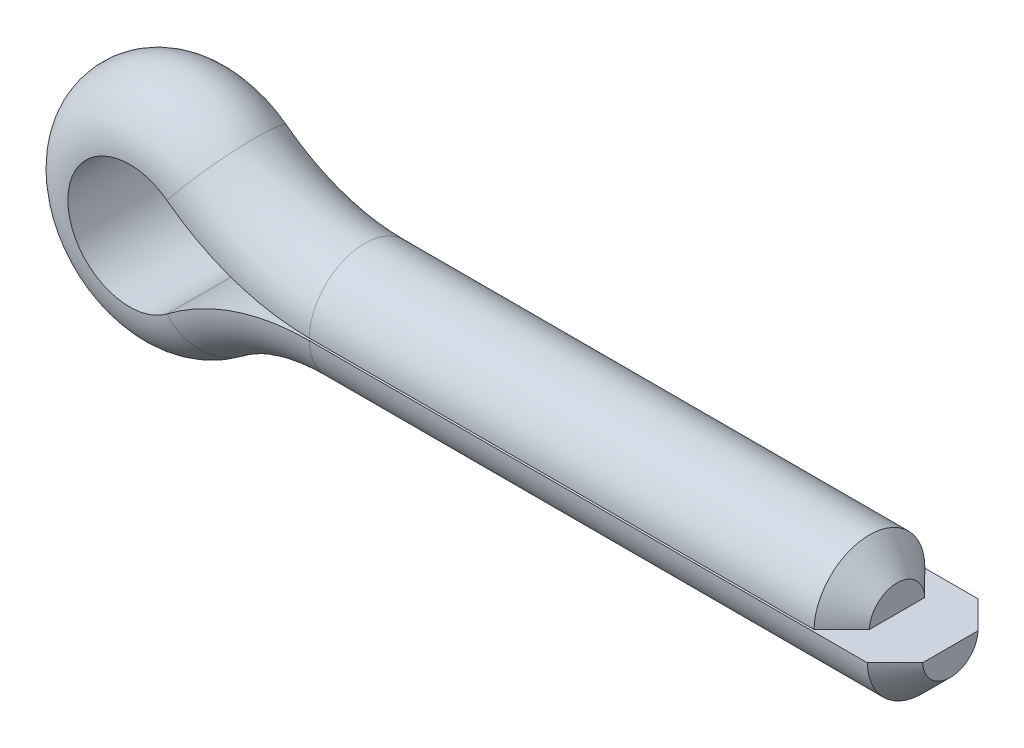
ISO-10303-21;
HEADER;
FILE_DESCRIPTION(('STEP AP214'),'2;1');
FILE_NAME('part.step','',(''),(''),'','','');
FILE_SCHEMA(('AUTOMOTIVE_DESIGN { 1 0 10303 214 1 1 1 1 }'));
ENDSEC;
DATA;
#1=APPLICATION_CONTEXT('core data for automotive mechanical design processes');
#2=APPLICATION_PROTOCOL_DEFINITION('international standard','automotive_design',2000,#1);
#3=PRODUCT_CONTEXT('',#1,'mechanical');
#4=PRODUCT('Part','Part','',(#3));
#5=PRODUCT_RELATED_PRODUCT_CATEGORY('part','',(#4));
#6=PRODUCT_DEFINITION_FORMATION('','',#4);
#7=PRODUCT_DEFINITION_CONTEXT('part definition',#1,'design');
#8=PRODUCT_DEFINITION('design','',#6,#7);
#9=PRODUCT_DEFINITION_SHAPE('','',#8);
#10=(LENGTH_UNIT() NAMED_UNIT(*) SI_UNIT(.MILLI.,.METRE.));
#11=(NAMED_UNIT(*) PLANE_ANGLE_UNIT() SI_UNIT($,.RADIAN.));
#12=(NAMED_UNIT(*) SI_UNIT($,.STERADIAN.) SOLID_ANGLE_UNIT());
#13=UNCERTAINTY_MEASURE_WITH_UNIT(LENGTH_MEASURE(1.E-05),#10,'distance_accuracy_value','');
#14=(GEOMETRIC_REPRESENTATION_CONTEXT(3) GLOBAL_UNCERTAINTY_ASSIGNED_CONTEXT((#13)) GLOBAL_UNIT_ASSIGNED_CONTEXT((#10,
#11,#12)) REPRESENTATION_CONTEXT('',''));
#15=CARTESIAN_POINT('',(0.,0.,0.));
#16=DIRECTION('',(0.,0.,1.));
#17=DIRECTION('',(1.,0.,0.));
#18=AXIS2_PLACEMENT_3D('',#15,#16,#17);
#19=CARTESIAN_POINT('',(1.27,0.,0.));
#20=DIRECTION('',(-1.,0.,0.));
#21=DIRECTION('',(0.,0.,-1.));
#22=AXIS2_PLACEMENT_3D('',#19,#20,#21);
#23=PLANE('',#22);
#24=DIRECTION('',(0.,0.,-1.));
#25=VECTOR('',#24,1.);
#26=CARTESIAN_POINT('',(1.27,-0.0254,1.32055574664609));
#27=LINE('',#26,#25);
#28=CARTESIAN_POINT('',(1.27,-0.0254,0.659911357683741));
#29=VERTEX_POINT('',#28);
#30=CARTESIAN_POINT('',(1.27,-0.0254000000000001,-0.65991135768374));
#31=VERTEX_POINT('',#30);
#32=EDGE_CURVE('E136',#29,#31,#27,.T.);
#33=ORIENTED_EDGE('',*,*,#32,.F.);
#34=CARTESIAN_POINT('',(1.27,0.,0.));
#35=DIRECTION('',(-1.,0.,0.));
#36=DIRECTION('',(0.,-1.,0.));
#37=AXIS2_PLACEMENT_3D('',#34,#35,#36);
#38=CIRCLE('',#37,0.660399999999999);
#39=EDGE_CURVE('E243',#29,#31,#38,.F.);
#40=ORIENTED_EDGE('',*,*,#39,.T.);
#41=EDGE_LOOP('',(#33,#40));
#42=FACE_BOUND('',#41,.T.);
#43=ADVANCED_FACE('F58',(#42),#23,.F.);
#44=CARTESIAN_POINT('',(0.,0.,0.));
#45=DIRECTION('',(1.,0.,0.));
#46=DIRECTION('',(0.,0.,-1.));
#47=AXIS2_PLACEMENT_3D('',#44,#45,#46);
#48=PLANE('',#47);
#49=DIRECTION('',(0.,0.,-1.));
#50=VECTOR('',#49,1.);
#51=CARTESIAN_POINT('',(0.,0.0254,1.32055574664609));
#52=LINE('',#51,#50);
#53=CARTESIAN_POINT('',(0.,0.0254,0.659911357683748));
#54=VERTEX_POINT('',#53);
#55=CARTESIAN_POINT('',(0.,0.0254000000000001,-0.659911357683747));
#56=VERTEX_POINT('',#55);
#57=EDGE_CURVE('E183',#54,#56,#52,.T.);
#58=ORIENTED_EDGE('',*,*,#57,.T.);
#59=CARTESIAN_POINT('',(0.,0.,0.));
#60=DIRECTION('',(1.,0.,0.));
#61=DIRECTION('',(0.,0.,-1.));
#62=AXIS2_PLACEMENT_3D('',#59,#60,#61);
#63=CIRCLE('',#62,0.660400000000005);
#64=EDGE_CURVE('E240',#56,#54,#63,.T.);
#65=ORIENTED_EDGE('',*,*,#64,.T.);
#66=EDGE_LOOP('',(#58,#65));
#67=FACE_BOUND('',#66,.T.);
#68=ADVANCED_FACE('F219',(#67),#48,.T.);
#69=CARTESIAN_POINT('',(1.27,0.,0.));
#70=DIRECTION('',(-1.,0.,0.));
#71=DIRECTION('',(0.,-1.,0.));
#72=AXIS2_PLACEMENT_3D('',#69,#70,#71);
#73=CYLINDRICAL_SURFACE('',#72,1.3208);
#74=DIRECTION('',(-1.,0.,0.));
#75=VECTOR('',#74,1.);
#76=CARTESIAN_POINT('',(1.27,-0.0254000000000001,-1.32055574664609));
#77=LINE('',#76,#75);
#78=CARTESIAN_POINT('',(0.609599999999996,-0.0254,-1.32055574664609));
#79=VERTEX_POINT('',#78);
#80=CARTESIAN_POINT('',(-12.7,-0.0253999999999985,-1.32055574664609));
#81=VERTEX_POINT('',#80);
#82=EDGE_CURVE('E121',#79,#81,#77,.T.);
#83=ORIENTED_EDGE('',*,*,#82,.F.);
#84=CARTESIAN_POINT('',(0.609599999999996,0.,0.));
#85=DIRECTION('',(-1.,0.,0.));
#86=DIRECTION('',(0.,-1.,0.));
#87=AXIS2_PLACEMENT_3D('',#84,#85,#86);
#88=CIRCLE('',#87,1.3208);
#89=CARTESIAN_POINT('',(0.609599999999996,-0.0253999999999999,1.32055574664609));
#90=VERTEX_POINT('',#89);
#91=EDGE_CURVE('E195',#79,#90,#88,.T.);
#92=ORIENTED_EDGE('',*,*,#91,.T.);
#93=DIRECTION('',(-1.,0.,0.));
#94=VECTOR('',#93,1.);
#95=CARTESIAN_POINT('',(1.27,-0.0254,1.32055574664609));
#96=LINE('',#95,#94);
#97=CARTESIAN_POINT('',(-12.7,-0.0253999999999983,1.32055574664609));
#98=VERTEX_POINT('',#97);
#99=EDGE_CURVE('E152',#90,#98,#96,.T.);
#100=ORIENTED_EDGE('',*,*,#99,.T.);
#101=CARTESIAN_POINT('',(-12.7,0.,0.));
#102=DIRECTION('',(-1.,0.,0.));
#103=DIRECTION('',(0.,0.,-1.));
#104=AXIS2_PLACEMENT_3D('',#101,#102,#103);
#105=CIRCLE('',#104,1.3208);
#106=EDGE_CURVE('E135',#81,#98,#105,.T.);
#107=ORIENTED_EDGE('',*,*,#106,.F.);
#108=EDGE_LOOP('',(#83,#92,#100,#107));
#109=FACE_BOUND('',#108,.T.);
#110=ADVANCED_FACE('F154',(#109),#73,.T.);
#111=CARTESIAN_POINT('',(1.27,-0.0254,1.32055574664609));
#112=DIRECTION('',(0.,1.,0.));
#113=DIRECTION('',(-1.,0.,0.));
#114=AXIS2_PLACEMENT_3D('',#111,#112,#113);
#115=PLANE('',#114);
#116=ORIENTED_EDGE('',*,*,#99,.F.);
#117=CARTESIAN_POINT('',(0.609599999999996,-0.0253999999999999,1.32055574664609));
#118=CARTESIAN_POINT('',(0.719680251228278,-0.0253999999999999,1.21046192830129));
#119=CARTESIAN_POINT('',(0.829753710105949,-0.0254,1.10036132011854));
#120=CARTESIAN_POINT('',(1.04988704343932,-0.0254,0.880146523797791));
#121=CARTESIAN_POINT('',(1.15994691789498,-0.0254,0.770032335659758));
#122=CARTESIAN_POINT('',(1.27,-0.0254,0.659911357683741));
#123=B_SPLINE_CURVE_WITH_KNOTS('',3,(#117,#118,#119,#120,#121,#122),.UNSPECIFIED.,.F.,.F.,(4,2,
4),(0.,0.467059731130343,0.934119463445654),.UNSPECIFIED.);
#124=EDGE_CURVE('E202',#90,#29,#123,.T.);
#125=ORIENTED_EDGE('',*,*,#124,.T.);
#126=ORIENTED_EDGE('',*,*,#32,.T.);
#127=CARTESIAN_POINT('',(1.27,-0.0254000000000001,-0.659911357683741));
#128=CARTESIAN_POINT('',(1.08768777436221,-0.0254000000000001,-0.842327973854175));
#129=CARTESIAN_POINT('',(0.905360257765116,-0.0254000000000001,-1.02472930370601));
#130=CARTESIAN_POINT('',(0.685212290766379,-0.0254000000000001,-1.24492947080261));
#131=CARTESIAN_POINT('',(0.647406474030141,-0.0254000000000001,-1.28274293727156));
#132=CARTESIAN_POINT('',(0.609599999999996,-0.0254,-1.32055574664609));
#133=B_SPLINE_CURVE_WITH_KNOTS('',3,(#127,#128,#129,#130,#131,#132),.UNSPECIFIED.,.F.,.F.,(4,2,
4),(0.,0.773706737699516,0.934119462348877),.UNSPECIFIED.);
#134=EDGE_CURVE('E130',#31,#79,#133,.T.);
#135=ORIENTED_EDGE('',*,*,#134,.T.);
#136=ORIENTED_EDGE('',*,*,#82,.T.);
#137=DIRECTION('',(0.,0.,-1.));
#138=VECTOR('',#137,1.);
#139=CARTESIAN_POINT('',(-12.7,-0.0253999999999983,1.32055574664609));
#140=LINE('',#139,#138);
#141=EDGE_CURVE('E126',#98,#81,#140,.T.);
#142=ORIENTED_EDGE('',*,*,#141,.F.);
#143=EDGE_LOOP('',(#116,#125,#126,#135,#136,#142));
#144=FACE_BOUND('',#143,.T.);
#145=ADVANCED_FACE('F124',(#144),#115,.T.);
#146=CARTESIAN_POINT('',(-12.7,-5.6134,0.));
#147=DIRECTION('',(0.,0.,1.));
#148=DIRECTION('',(1.,0.,0.));
#149=AXIS2_PLACEMENT_3D('',#146,#147,#148);
#150=TOROIDAL_SURFACE('',#149,5.6134,1.3208);
#151=CARTESIAN_POINT('',(-12.7,-5.6134,1.32055574664609));
#152=DIRECTION('',(0.,0.,1.));
#153=DIRECTION('',(0.,1.,0.));
#154=AXIS2_PLACEMENT_3D('',#151,#152,#153);
#155=CIRCLE('',#154,5.588);
#156=CARTESIAN_POINT('',(-16.0899969086765,-1.17114100719425,1.32055574664609));
#157=VERTEX_POINT('',#156);
#158=EDGE_CURVE('E151',#98,#157,#155,.T.);
#159=ORIENTED_EDGE('',*,*,#158,.T.);
#160=CARTESIAN_POINT('',(-16.1054059855342,-1.15094892086331,0.));
#161=DIRECTION('',(-0.794964028776978,-0.606656569197661,0.));
#162=DIRECTION('',(0.,0.,-1.));
#163=AXIS2_PLACEMENT_3D('',#160,#161,#162);
#164=CIRCLE('',#163,1.3208);
#165=CARTESIAN_POINT('',(-16.0899969086765,-1.17114100719425,-1.32055574664609));
#166=VERTEX_POINT('',#165);
#167=EDGE_CURVE('E145',#166,#157,#164,.T.);
#168=ORIENTED_EDGE('',*,*,#167,.F.);
#169=CARTESIAN_POINT('',(-12.7,-5.6134,-1.32055574664609));
#170=DIRECTION('',(0.,0.,1.));
#171=DIRECTION('',(0.,1.,0.));
#172=AXIS2_PLACEMENT_3D('',#169,#170,#171);
#173=CIRCLE('',#172,5.588);
#174=EDGE_CURVE('E141',#81,#166,#173,.T.);
#175=ORIENTED_EDGE('',*,*,#174,.F.);
#176=ORIENTED_EDGE('',*,*,#106,.T.);
#177=EDGE_LOOP('',(#159,#168,#175,#176));
#178=FACE_BOUND('',#177,.T.);
#179=ADVANCED_FACE('F143',(#178),#150,.T.);
#180=CARTESIAN_POINT('',(-12.7,-5.6134,0.));
#181=DIRECTION('',(0.,0.,1.));
#182=DIRECTION('',(1.,0.,0.));
#183=AXIS2_PLACEMENT_3D('',#180,#181,#182);
#184=CYLINDRICAL_SURFACE('',#183,5.588);
#185=DIRECTION('',(0.,0.,-1.));
#186=VECTOR('',#185,1.);
#187=CARTESIAN_POINT('',(-16.0899969086765,-1.17114100719425,1.32055574664609));
#188=LINE('',#187,#186);
#189=EDGE_CURVE('E159',#157,#166,#188,.T.);
#190=ORIENTED_EDGE('',*,*,#189,.F.);
#191=ORIENTED_EDGE('',*,*,#158,.F.);
#192=ORIENTED_EDGE('',*,*,#141,.T.);
#193=ORIENTED_EDGE('',*,*,#174,.T.);
#194=EDGE_LOOP('',(#190,#191,#192,#193));
#195=FACE_BOUND('',#194,.T.);
#196=ADVANCED_FACE('F150',(#195),#184,.T.);
#197=CARTESIAN_POINT('',(-16.9837233664185,0.,0.));
#198=DIRECTION('',(0.,0.,-1.));
#199=DIRECTION('',(-1.,0.,0.));
#200=AXIS2_PLACEMENT_3D('',#197,#198,#199);
#201=TOROIDAL_SURFACE('',#200,1.4478,1.3208);
#202=CARTESIAN_POINT('',(-16.9837233664185,0.,1.32055574664609));
#203=DIRECTION('',(0.,0.,-1.));
#204=DIRECTION('',(0.60665656919766,-0.794964028776978,0.));
#205=AXIS2_PLACEMENT_3D('',#202,#203,#204);
#206=CIRCLE('',#205,1.4732);
#207=CARTESIAN_POINT('',(-16.0899969086765,1.17114100719425,1.32055574664609));
#208=VERTEX_POINT('',#207);
#209=EDGE_CURVE('E164',#157,#208,#206,.T.);
#210=ORIENTED_EDGE('',*,*,#209,.T.);
#211=CARTESIAN_POINT('',(-16.1054059855342,1.15094892086331,0.));
#212=DIRECTION('',(0.794964028776978,-0.60665656919766,0.));
#213=DIRECTION('',(0.,0.,-1.));
#214=AXIS2_PLACEMENT_3D('',#211,#212,#213);
#215=CIRCLE('',#214,1.3208);
#216=CARTESIAN_POINT('',(-16.0899969086765,1.17114100719425,-1.32055574664609));
#217=VERTEX_POINT('',#216);
#218=EDGE_CURVE('E161',#217,#208,#215,.T.);
#219=ORIENTED_EDGE('',*,*,#218,.F.);
#220=CARTESIAN_POINT('',(-16.9837233664185,0.,-1.32055574664609));
#221=DIRECTION('',(0.,0.,-1.));
#222=DIRECTION('',(0.60665656919766,-0.794964028776978,0.));
#223=AXIS2_PLACEMENT_3D('',#220,#221,#222);
#224=CIRCLE('',#223,1.4732);
#225=EDGE_CURVE('E165',#166,#217,#224,.T.);
#226=ORIENTED_EDGE('',*,*,#225,.F.);
#227=ORIENTED_EDGE('',*,*,#167,.T.);
#228=EDGE_LOOP('',(#210,#219,#226,#227));
#229=FACE_BOUND('',#228,.T.);
#230=ADVANCED_FACE('F287',(#229),#201,.T.);
#231=CARTESIAN_POINT('',(-16.9837233664185,0.,0.));
#232=DIRECTION('',(0.,0.,-1.));
#233=DIRECTION('',(-1.,0.,0.));
#234=AXIS2_PLACEMENT_3D('',#231,#232,#233);
#235=CYLINDRICAL_SURFACE('',#234,1.4732);
#236=DIRECTION('',(0.,0.,-1.));
#237=VECTOR('',#236,1.);
#238=CARTESIAN_POINT('',(-16.0899969086765,1.17114100719425,1.32055574664609));
#239=LINE('',#238,#237);
#240=EDGE_CURVE('E168',#208,#217,#239,.T.);
#241=ORIENTED_EDGE('',*,*,#240,.F.);
#242=ORIENTED_EDGE('',*,*,#209,.F.);
#243=ORIENTED_EDGE('',*,*,#189,.T.);
#244=ORIENTED_EDGE('',*,*,#225,.T.);
#245=EDGE_LOOP('',(#241,#242,#243,#244));
#246=FACE_BOUND('',#245,.T.);
#247=ADVANCED_FACE('F279',(#246),#235,.F.);
#248=CARTESIAN_POINT('',(-12.7,5.6134,0.));
#249=DIRECTION('',(0.,0.,1.));
#250=DIRECTION('',(1.,0.,0.));
#251=AXIS2_PLACEMENT_3D('',#248,#249,#250);
#252=TOROIDAL_SURFACE('',#251,5.6134,1.3208);
#253=CARTESIAN_POINT('',(-12.7,5.6134,1.32055574664609));
#254=DIRECTION('',(0.,0.,1.));
#255=DIRECTION('',(-0.606656569197661,-0.794964028776978,0.));
#256=AXIS2_PLACEMENT_3D('',#253,#254,#255);
#257=CIRCLE('',#256,5.588);
#258=CARTESIAN_POINT('',(-12.7,0.0253999999999992,1.32055574664609));
#259=VERTEX_POINT('',#258);
#260=EDGE_CURVE('E174',#208,#259,#257,.T.);
#261=ORIENTED_EDGE('',*,*,#260,.T.);
#262=CARTESIAN_POINT('',(-12.7,0.,0.));
#263=DIRECTION('',(1.,0.,0.));
#264=DIRECTION('',(0.,0.,-1.));
#265=AXIS2_PLACEMENT_3D('',#262,#263,#264);
#266=CIRCLE('',#265,1.3208);
#267=CARTESIAN_POINT('',(-12.7,0.0253999999999992,-1.32055574664609));
#268=VERTEX_POINT('',#267);
#269=EDGE_CURVE('E171',#268,#259,#266,.T.);
#270=ORIENTED_EDGE('',*,*,#269,.F.);
#271=CARTESIAN_POINT('',(-12.7,5.6134,-1.32055574664609));
#272=DIRECTION('',(0.,0.,1.));
#273=DIRECTION('',(-0.606656569197661,-0.794964028776978,0.));
#274=AXIS2_PLACEMENT_3D('',#271,#272,#273);
#275=CIRCLE('',#274,5.588);
#276=EDGE_CURVE('E175',#217,#268,#275,.T.);
#277=ORIENTED_EDGE('',*,*,#276,.F.);
#278=ORIENTED_EDGE('',*,*,#218,.T.);
#279=EDGE_LOOP('',(#261,#270,#277,#278));
#280=FACE_BOUND('',#279,.T.);
#281=ADVANCED_FACE('F271',(#280),#252,.T.);
#282=CARTESIAN_POINT('',(-12.7,5.6134,0.));
#283=DIRECTION('',(0.,0.,1.));
#284=DIRECTION('',(1.,0.,0.));
#285=AXIS2_PLACEMENT_3D('',#282,#283,#284);
#286=CYLINDRICAL_SURFACE('',#285,5.588);
#287=DIRECTION('',(0.,0.,-1.));
#288=VECTOR('',#287,1.);
#289=CARTESIAN_POINT('',(-12.7,0.0253999999999983,1.32055574664609));
#290=LINE('',#289,#288);
#291=EDGE_CURVE('E178',#259,#268,#290,.T.);
#292=ORIENTED_EDGE('',*,*,#291,.F.);
#293=ORIENTED_EDGE('',*,*,#260,.F.);
#294=ORIENTED_EDGE('',*,*,#240,.T.);
#295=ORIENTED_EDGE('',*,*,#276,.T.);
#296=EDGE_LOOP('',(#292,#293,#294,#295));
#297=FACE_BOUND('',#296,.T.);
#298=ADVANCED_FACE('F228',(#297),#286,.T.);
#299=CARTESIAN_POINT('',(-12.7,0.,0.));
#300=DIRECTION('',(1.,0.,0.));
#301=DIRECTION('',(0.,1.,0.));
#302=AXIS2_PLACEMENT_3D('',#299,#300,#301);
#303=CYLINDRICAL_SURFACE('',#302,1.3208);
#304=DIRECTION('',(1.,0.,0.));
#305=VECTOR('',#304,1.);
#306=CARTESIAN_POINT('',(-12.7,0.0253999999999992,1.32055574664609));
#307=LINE('',#306,#305);
#308=CARTESIAN_POINT('',(-0.660399999999997,0.0254,1.32055574664609));
#309=VERTEX_POINT('',#308);
#310=EDGE_CURVE('E181',#259,#309,#307,.T.);
#311=ORIENTED_EDGE('',*,*,#310,.T.);
#312=CARTESIAN_POINT('',(-0.660399999999997,0.,0.));
#313=DIRECTION('',(1.,0.,0.));
#314=DIRECTION('',(0.,1.,0.));
#315=AXIS2_PLACEMENT_3D('',#312,#313,#314);
#316=CIRCLE('',#315,1.3208);
#317=CARTESIAN_POINT('',(-0.660399999999997,0.0254000000000001,-1.32055574664609));
#318=VERTEX_POINT('',#317);
#319=EDGE_CURVE('E12',#309,#318,#316,.F.);
#320=ORIENTED_EDGE('',*,*,#319,.T.);
#321=DIRECTION('',(1.,0.,0.));
#322=VECTOR('',#321,1.);
#323=CARTESIAN_POINT('',(-12.7,0.0253999999999993,-1.32055574664609));
#324=LINE('',#323,#322);
#325=EDGE_CURVE('E184',#268,#318,#324,.T.);
#326=ORIENTED_EDGE('',*,*,#325,.F.);
#327=ORIENTED_EDGE('',*,*,#269,.T.);
#328=EDGE_LOOP('',(#311,#320,#326,#327));
#329=FACE_BOUND('',#328,.T.);
#330=ADVANCED_FACE('F227',(#329),#303,.T.);
#331=CARTESIAN_POINT('',(-12.7,0.0253999999999992,1.32055574664609));
#332=DIRECTION('',(0.,-1.,0.));
#333=DIRECTION('',(1.,0.,0.));
#334=AXIS2_PLACEMENT_3D('',#331,#332,#333);
#335=PLANE('',#334);
#336=ORIENTED_EDGE('',*,*,#57,.F.);
#337=CARTESIAN_POINT('',(0.,0.0254,0.659911357683748));
#338=CARTESIAN_POINT('',(-0.182312225637788,0.0254,0.842327973854184));
#339=CARTESIAN_POINT('',(-0.364639742234886,0.0254,1.02472930370602));
#340=CARTESIAN_POINT('',(-0.584787709233622,0.0254,1.24492947080262));
#341=CARTESIAN_POINT('',(-0.622593525969856,0.0254,1.28274293727156));
#342=CARTESIAN_POINT('',(-0.660399999999997,0.0254,1.32055574664609));
#343=B_SPLINE_CURVE_WITH_KNOTS('',3,(#337,#338,#339,#340,#341,#342),.UNSPECIFIED.,.F.,.F.,(4,2,
4),(0.,0.773706737699525,0.93411946234887),.UNSPECIFIED.);
#344=EDGE_CURVE('E67',#54,#309,#343,.T.);
#345=ORIENTED_EDGE('',*,*,#344,.T.);
#346=ORIENTED_EDGE('',*,*,#310,.F.);
#347=ORIENTED_EDGE('',*,*,#291,.T.);
#348=ORIENTED_EDGE('',*,*,#325,.T.);
#349=CARTESIAN_POINT('',(-0.660399999999997,0.0254000000000001,-1.32055574664609));
#350=CARTESIAN_POINT('',(-0.550319748771716,0.0254000000000001,-1.21046192830129));
#351=CARTESIAN_POINT('',(-0.440246289894046,0.0254000000000001,-1.10036132011854));
#352=CARTESIAN_POINT('',(-0.220112956560679,0.0254000000000001,-0.880146523797795));
#353=CARTESIAN_POINT('',(-0.110053082105017,0.0254000000000001,-0.770032335659764));
#354=CARTESIAN_POINT('',(0.,0.0254000000000001,-0.659911357683748));
#355=B_SPLINE_CURVE_WITH_KNOTS('',3,(#349,#350,#351,#352,#353,#354),.UNSPECIFIED.,.F.,.F.,(4,2,
4),(0.,0.467059731130339,0.934119463445646),.UNSPECIFIED.);
#356=EDGE_CURVE('E232',#318,#56,#355,.T.);
#357=ORIENTED_EDGE('',*,*,#356,.T.);
#358=EDGE_LOOP('',(#336,#345,#346,#347,#348,#357));
#359=FACE_BOUND('',#358,.T.);
#360=ADVANCED_FACE('F214',(#359),#335,.T.);
#361=CARTESIAN_POINT('',(0.609599999999996,0.,0.));
#362=DIRECTION('',(-1.,0.,0.));
#363=DIRECTION('',(0.,-1.,0.));
#364=AXIS2_PLACEMENT_3D('',#361,#362,#363);
#365=CONICAL_SURFACE('',#364,1.3208,0.785398163397449);
#366=ORIENTED_EDGE('',*,*,#134,.F.);
#367=ORIENTED_EDGE('',*,*,#39,.F.);
#368=ORIENTED_EDGE('',*,*,#124,.F.);
#369=ORIENTED_EDGE('',*,*,#91,.F.);
#370=EDGE_LOOP('',(#366,#367,#368,#369));
#371=FACE_BOUND('',#370,.T.);
#372=ADVANCED_FACE('F210',(#371),#365,.T.);
#373=CARTESIAN_POINT('',(0.,0.,0.));
#374=DIRECTION('',(-1.,0.,0.));
#375=DIRECTION('',(0.,-1.,0.));
#376=AXIS2_PLACEMENT_3D('',#373,#374,#375);
#377=CONICAL_SURFACE('',#376,0.660400000000005,0.785398163397447);
#378=ORIENTED_EDGE('',*,*,#356,.F.);
#379=ORIENTED_EDGE('',*,*,#319,.F.);
#380=ORIENTED_EDGE('',*,*,#344,.F.);
#381=ORIENTED_EDGE('',*,*,#64,.F.);
#382=EDGE_LOOP('',(#378,#379,#380,#381));
#383=FACE_BOUND('',#382,.T.);
#384=ADVANCED_FACE('F60',(#383),#377,.T.);
#385=CLOSED_SHELL('',(#43,#68,#110,#145,#179,#196,#230,#247,#281,#298,#330,#360,#372,#384));
#386=MANIFOLD_SOLID_BREP('B2',#385);
#387=ADVANCED_BREP_SHAPE_REPRESENTATION('',(#18,#386),#14);
#388=SHAPE_DEFINITION_REPRESENTATION(#9,#387);
ENDSEC;
END-ISO-10303-21;
